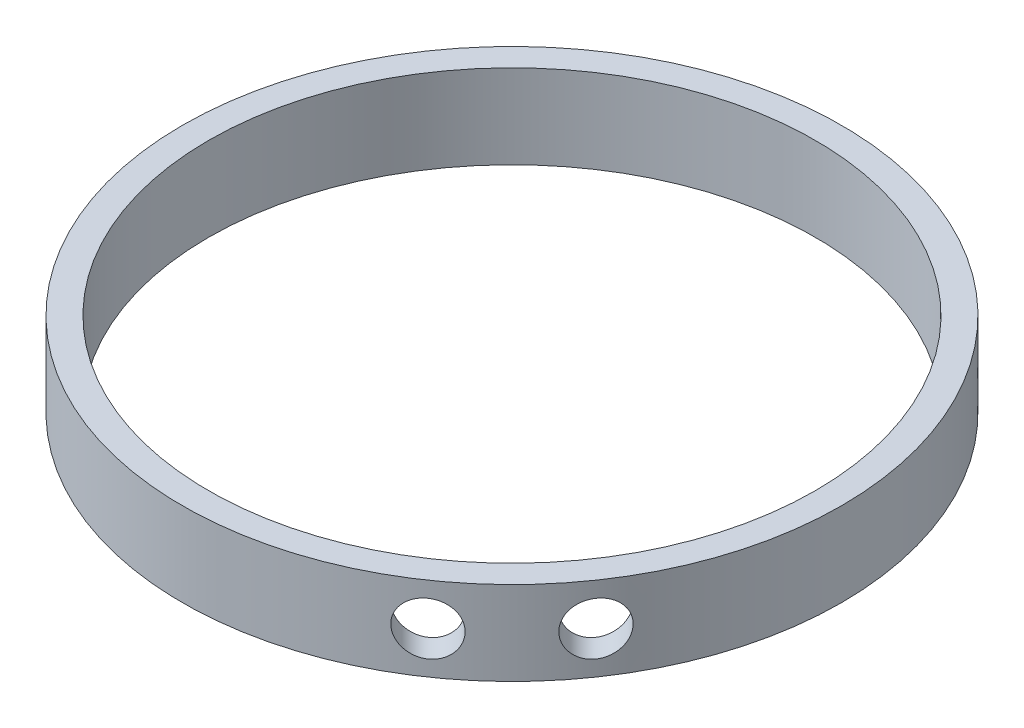
ISO-10303-21;
HEADER;
FILE_DESCRIPTION(('STEP AP214'),'2;1');
FILE_NAME('part.step','',(''),(''),'','','');
FILE_SCHEMA(('AUTOMOTIVE_DESIGN { 1 0 10303 214 1 1 1 1 }'));
ENDSEC;
DATA;
#1=APPLICATION_CONTEXT('core data for automotive mechanical design processes');
#2=APPLICATION_PROTOCOL_DEFINITION('international standard','automotive_design',2000,#1);
#3=PRODUCT_CONTEXT('',#1,'mechanical');
#4=PRODUCT('Part','Part','',(#3));
#5=PRODUCT_RELATED_PRODUCT_CATEGORY('part','',(#4));
#6=PRODUCT_DEFINITION_FORMATION('','',#4);
#7=PRODUCT_DEFINITION_CONTEXT('part definition',#1,'design');
#8=PRODUCT_DEFINITION('design','',#6,#7);
#9=PRODUCT_DEFINITION_SHAPE('','',#8);
#10=(LENGTH_UNIT() NAMED_UNIT(*) SI_UNIT(.MILLI.,.METRE.));
#11=(NAMED_UNIT(*) PLANE_ANGLE_UNIT() SI_UNIT($,.RADIAN.));
#12=(NAMED_UNIT(*) SI_UNIT($,.STERADIAN.) SOLID_ANGLE_UNIT());
#13=UNCERTAINTY_MEASURE_WITH_UNIT(LENGTH_MEASURE(1.E-05),#10,'distance_accuracy_value','');
#14=(GEOMETRIC_REPRESENTATION_CONTEXT(3) GLOBAL_UNCERTAINTY_ASSIGNED_CONTEXT((#13)) GLOBAL_UNIT_ASSIGNED_CONTEXT((#10,
#11,#12)) REPRESENTATION_CONTEXT('',''));
#15=CARTESIAN_POINT('',(0.,0.,0.));
#16=DIRECTION('',(0.,0.,1.));
#17=DIRECTION('',(1.,0.,0.));
#18=AXIS2_PLACEMENT_3D('',#15,#16,#17);
#19=CARTESIAN_POINT('',(50.6984,108.966,0.));
#20=DIRECTION('',(0.,-1.,0.));
#21=DIRECTION('',(1.,0.,0.));
#22=AXIS2_PLACEMENT_3D('',#19,#20,#21);
#23=PLANE('',#22);
#24=CARTESIAN_POINT('',(0.,108.966,0.));
#25=DIRECTION('',(0.,1.,0.));
#26=DIRECTION('',(-1.,0.,0.));
#27=AXIS2_PLACEMENT_3D('',#24,#25,#26);
#28=CIRCLE('',#27,52.832);
#29=CARTESIAN_POINT('',(-52.832,108.966,0.));
#30=VERTEX_POINT('',#29);
#31=EDGE_CURVE('E53',#30,#30,#28,.T.);
#32=ORIENTED_EDGE('',*,*,#31,.T.);
#33=EDGE_LOOP('',(#32));
#34=FACE_BOUND('',#33,.T.);
#35=CARTESIAN_POINT('',(0.,108.966,0.));
#36=DIRECTION('',(0.,-1.,0.));
#37=DIRECTION('',(1.,0.,0.));
#38=AXIS2_PLACEMENT_3D('',#35,#36,#37);
#39=CIRCLE('',#38,48.641);
#40=CARTESIAN_POINT('',(48.641,108.966,0.));
#41=VERTEX_POINT('',#40);
#42=EDGE_CURVE('E96',#41,#41,#39,.T.);
#43=ORIENTED_EDGE('',*,*,#42,.T.);
#44=EDGE_LOOP('',(#43));
#45=FACE_BOUND('',#44,.T.);
#46=ADVANCED_FACE('F41',(#34,#45),#23,.F.);
#47=CARTESIAN_POINT('',(0.,138.931800571307,0.));
#48=DIRECTION('',(0.,1.,0.));
#49=DIRECTION('',(-1.,0.,0.));
#50=AXIS2_PLACEMENT_3D('',#47,#48,#49);
#51=CYLINDRICAL_SURFACE('',#50,52.832);
#52=CARTESIAN_POINT('',(35.9911854648936,102.235,-38.6762820450936));
#53=CARTESIAN_POINT('',(35.9911891251565,102.128388948194,-38.6762790353523));
#54=CARTESIAN_POINT('',(35.9977870100752,102.021701469772,-38.6701420674387));
#55=CARTESIAN_POINT('',(36.0239957140699,101.811267276668,-38.6457276445082));
#56=CARTESIAN_POINT('',(36.043622025432,101.707524216566,-38.6274357358532));
#57=CARTESIAN_POINT('',(36.0952698779711,101.506057813562,-38.5791777823933));
#58=CARTESIAN_POINT('',(36.1272852928998,101.408331523088,-38.5492175073947));
#59=CARTESIAN_POINT('',(36.2027070266943,101.221649723681,-38.4783951198653));
#60=CARTESIAN_POINT('',(36.2461105873962,101.132692098181,-38.4375356470373));
#61=CARTESIAN_POINT('',(36.3429988416192,100.96599296856,-38.345939712509));
#62=CARTESIAN_POINT('',(36.3964886465669,100.888257186777,-38.2951982424591));
#63=CARTESIAN_POINT('',(36.511905302874,100.746256785229,-38.1851717077652));
#64=CARTESIAN_POINT('',(36.5738324920968,100.681992705181,-38.1258863009854));
#65=CARTESIAN_POINT('',(36.7042725394263,100.568748154399,-38.0003261293154));
#66=CARTESIAN_POINT('',(36.7727870537462,100.519771540518,-37.93404960628));
#67=CARTESIAN_POINT('',(36.9143499540226,100.43851712426,-37.7963058372317));
#68=CARTESIAN_POINT('',(36.9873983178574,100.406239240414,-37.724838616545));
#69=CARTESIAN_POINT('',(37.1358550292209,100.359312002503,-37.5787085060975));
#70=CARTESIAN_POINT('',(37.2112623346822,100.344654974139,-37.5040470221966));
#71=CARTESIAN_POINT('',(37.3622933241103,100.333361847808,-37.3535891440961));
#72=CARTESIAN_POINT('',(37.4379170070065,100.336725660826,-37.2777927555043));
#73=CARTESIAN_POINT('',(37.5872047581345,100.361372296027,-37.1272608371456));
#74=CARTESIAN_POINT('',(37.6608697150397,100.382646843909,-37.0525248337166));
#75=CARTESIAN_POINT('',(37.8042316035084,100.442498233258,-36.9062432670479));
#76=CARTESIAN_POINT('',(37.8739285244002,100.481075121256,-36.8346977123888));
#77=CARTESIAN_POINT('',(38.0074723074687,100.574445613952,-36.6968866836979));
#78=CARTESIAN_POINT('',(38.0713177990794,100.62924300529,-36.6306224471678));
#79=CARTESIAN_POINT('',(38.1914340384486,100.753496211505,-36.5053712780388));
#80=CARTESIAN_POINT('',(38.2477047600365,100.822952077023,-36.446384370583));
#81=CARTESIAN_POINT('',(38.3512218164106,100.974597453319,-36.3374417403975));
#82=CARTESIAN_POINT('',(38.3984630300379,101.056794142586,-36.2874911435394));
#83=CARTESIAN_POINT('',(38.4826556609733,101.231562610481,-36.1981935454399));
#84=CARTESIAN_POINT('',(38.5196070763824,101.324134391024,-36.1588465461553));
#85=CARTESIAN_POINT('',(38.5822717844099,101.517029415104,-36.0919747096342));
#86=CARTESIAN_POINT('',(38.6079849087677,101.617352774671,-36.0644500494028));
#87=CARTESIAN_POINT('',(38.6475164071539,101.822901262283,-36.0220841469506));
#88=CARTESIAN_POINT('',(38.6613348275305,101.928126371226,-36.0072428553084));
#89=CARTESIAN_POINT('',(38.6767217960953,102.140428338628,-35.9907147107065));
#90=CARTESIAN_POINT('',(38.6782971928635,102.247504128238,-35.9890205034482));
#91=CARTESIAN_POINT('',(38.6691762593249,102.460523355244,-35.9988204600144));
#92=CARTESIAN_POINT('',(38.6584799496777,102.566466794546,-36.010314601636));
#93=CARTESIAN_POINT('',(38.6250912417336,102.774185901556,-36.0461252209459));
#94=CARTESIAN_POINT('',(38.6024019687354,102.875962647639,-36.0704383580722));
#95=CARTESIAN_POINT('',(38.5456061073569,103.072492434298,-36.1311249623008));
#96=CARTESIAN_POINT('',(38.5114994854134,103.167245454226,-36.1674984648565));
#97=CARTESIAN_POINT('',(38.4327238287584,103.347084341653,-36.251196597733));
#98=CARTESIAN_POINT('',(38.3880501003922,103.432165888381,-36.2985260942427));
#99=CARTESIAN_POINT('',(38.2893030662616,103.590203258514,-36.4026733963121));
#100=CARTESIAN_POINT('',(38.2352297276956,103.663159039602,-36.4594912349831));
#101=CARTESIAN_POINT('',(38.1190729837629,103.794907505079,-36.5809178098473));
#102=CARTESIAN_POINT('',(38.0569859342879,103.85369371099,-36.64553008956));
#103=CARTESIAN_POINT('',(37.9264752799857,103.955390016683,-36.7805859584982));
#104=CARTESIAN_POINT('',(37.8580516927094,103.998300160437,-36.8510295315723));
#105=CARTESIAN_POINT('',(37.7167420562791,104.067014919109,-36.995645720619));
#106=CARTESIAN_POINT('',(37.6438571033809,104.092823717918,-37.0698174197141));
#107=CARTESIAN_POINT('',(37.4956255624286,104.126616883972,-37.2197447052237));
#108=CARTESIAN_POINT('',(37.4202789793993,104.134601287597,-37.295500288405));
#109=CARTESIAN_POINT('',(37.2692914252668,104.132518545475,-37.4463820050562));
#110=CARTESIAN_POINT('',(37.1936506444338,104.122461591004,-37.5215084698223));
#111=CARTESIAN_POINT('',(37.0442013161862,104.084602607981,-37.6690642921508));
#112=CARTESIAN_POINT('',(36.9703927723641,104.056800544638,-37.7414936444246));
#113=CARTESIAN_POINT('',(36.8267589213333,103.984242239172,-37.881659542266));
#114=CARTESIAN_POINT('',(36.7569336743323,103.93948574086,-37.9493960169037));
#115=CARTESIAN_POINT('',(36.6233364041532,103.834291732404,-38.078341416311));
#116=CARTESIAN_POINT('',(36.5595641702965,103.773854768302,-38.1395505682772));
#117=CARTESIAN_POINT('',(36.4399559147707,103.638982329924,-38.253845503396));
#118=CARTESIAN_POINT('',(36.3841235403764,103.564540458556,-38.3069275541142));
#119=CARTESIAN_POINT('',(36.2821148122894,103.403762323211,-38.4035586891762));
#120=CARTESIAN_POINT('',(36.2359408491869,103.317423123232,-38.4471054135196));
#121=CARTESIAN_POINT('',(36.154659073159,103.135259116699,-38.5235509361549));
#122=CARTESIAN_POINT('',(36.1195592939607,103.039427489813,-38.5564420048014));
#123=CARTESIAN_POINT('',(36.0615953242634,102.841120551884,-38.6106611806726));
#124=CARTESIAN_POINT('',(36.0387165771221,102.738653308543,-38.6320030447147));
#125=CARTESIAN_POINT('',(36.0119587205039,102.568784464662,-38.6569429440298));
#126=CARTESIAN_POINT('',(36.0041794195579,102.502484907529,-38.6641867821554));
#127=CARTESIAN_POINT('',(35.9937916413014,102.36913365298,-38.6738572785532));
#128=CARTESIAN_POINT('',(35.9911831617778,102.302081955887,-38.6762839388873));
#129=CARTESIAN_POINT('',(35.9911854648936,102.235,-38.6762820450936));
#130=B_SPLINE_CURVE_WITH_KNOTS('',3,(#52,#53,#54,#55,#56,#57,#58,#59,#60,#61,#62,#63,#64,#65,
#66,#67,#68,#69,#70,#71,#72,#73,#74,#75,#76,#77,#78,#79,#80,#81,#82,#83,#84,#85,#86,#87,#88,#89,
#90,#91,#92,#93,#94,#95,#96,#97,#98,#99,#100,#101,#102,#103,#104,#105,#106,#107,#108,#109,#110,
#111,#112,#113,#114,#115,#116,#117,#118,#119,#120,#121,#122,#123,#124,#125,#126,#127,#128,#129),
.UNSPECIFIED.,.T.,.F.,(4,2,2,2,2,2,2,2,2,2,2,2,2,2,2,2,2,2,2,2,2,2,2,2,2,2,2,2,2,2,2,2,2,2,2,2,
2,2,4),(0.,0.319588293392277,0.639557296123156,0.95936828016603,1.27910187863723,
1.59899794675794,1.91890682844399,2.23889635437036,2.55888431912336,2.87873287101168,
3.19857984299758,3.51827913491017,3.83797928659264,4.15775413050739,4.47753007921197,
4.79748685676229,5.11744369336031,5.43740532021613,5.7573657003217,6.07714708606956,
6.39692793345835,6.71662548881663,7.03632398398792,7.35616474908745,7.67600663035106,
7.99599447046622,8.31598142431616,8.63589006353334,8.95579804976985,9.27552538196366,
9.59525334103685,9.91498613153832,10.2347077894689,10.554575844427,10.8745229777065,
11.1947016846305,11.5144981669767,11.7155900482812,11.9166818435123),.UNSPECIFIED.);
#131=CARTESIAN_POINT('',(35.9911854648936,102.235,-38.6762820450936));
#132=VERTEX_POINT('',#131);
#133=EDGE_CURVE('E10',#132,#132,#130,.T.);
#134=ORIENTED_EDGE('',*,*,#133,.T.);
#135=EDGE_LOOP('',(#134));
#136=FACE_BOUND('',#135,.T.);
#137=CARTESIAN_POINT('',(45.7887465015735,102.235,26.3554722555798));
#138=CARTESIAN_POINT('',(45.7887469768974,102.119294353157,26.3554711506068));
#139=CARTESIAN_POINT('',(45.7862851066702,102.003604677743,26.3597498776435));
#140=CARTESIAN_POINT('',(45.7764529513878,101.77302536689,26.3768208803745));
#141=CARTESIAN_POINT('',(45.7690813264415,101.658135958498,26.3896154800829));
#142=CARTESIAN_POINT('',(45.749465389697,101.429933427851,26.4236073240889));
#143=CARTESIAN_POINT('',(45.7372170611276,101.31662168489,26.4448114950016));
#144=CARTESIAN_POINT('',(45.7079187187507,101.0924348145,26.4954193148572));
#145=CARTESIAN_POINT('',(45.690866913648,100.981560612729,26.5248260226203));
#146=CARTESIAN_POINT('',(45.6520967395134,100.763247326726,26.5914980883896));
#147=CARTESIAN_POINT('',(45.630386472878,100.655802645652,26.6287497996316));
#148=CARTESIAN_POINT('',(45.5824127825326,100.444865310929,26.7107866437121));
#149=CARTESIAN_POINT('',(45.5561476817662,100.341374130116,26.7555745511412));
#150=CARTESIAN_POINT('',(45.4707567592938,100.037994553879,26.9006155141694));
#151=CARTESIAN_POINT('',(45.4049885345326,99.8449368518761,27.0116269453659));
#152=CARTESIAN_POINT('',(45.2559818971568,99.4792339202398,27.2605513800785));
#153=CARTESIAN_POINT('',(45.1724567500596,99.3070070903629,27.3989029053204));
#154=CARTESIAN_POINT('',(44.9904377536082,98.991080089496,27.6967716139618));
#155=CARTESIAN_POINT('',(44.8919412510913,98.8473849852125,27.8562925482804));
#156=CARTESIAN_POINT('',(44.6789353889756,98.588199780565,28.1967090218338));
#157=CARTESIAN_POINT('',(44.5640344370214,98.4736846219928,28.3781020592051));
#158=CARTESIAN_POINT('',(44.3232249518875,98.2815891627024,28.7527653797535));
#159=CARTESIAN_POINT('',(44.1973152761317,98.2040127011853,28.9460368951571));
#160=CARTESIAN_POINT('',(43.9355356760905,98.0870481639952,29.3418820111879));
#161=CARTESIAN_POINT('',(43.7995429565049,98.0482617185712,29.5445526228933));
#162=CARTESIAN_POINT('',(43.5229792739286,98.0122809948412,29.9504724406895));
#163=CARTESIAN_POINT('',(43.3824083946243,98.015085956692,30.1537216361421));
#164=CARTESIAN_POINT('',(43.1014628339092,98.0624166959423,30.5539460400328));
#165=CARTESIAN_POINT('',(42.961090626198,98.1067358676786,30.7509473265223));
#166=CARTESIAN_POINT('',(42.6842290739996,98.2358837372617,31.1341082964233));
#167=CARTESIAN_POINT('',(42.5477394163231,98.3207091577615,31.3202688555876));
#168=CARTESIAN_POINT('',(42.2852231881424,98.5271059374471,31.6737734105617));
#169=CARTESIAN_POINT('',(42.1590689644525,98.6480982328062,31.8413607178014));
#170=CARTESIAN_POINT('',(41.919286769872,98.9239850936208,32.1563813755126));
#171=CARTESIAN_POINT('',(41.8056578823957,99.0788771758601,32.3038162009028));
#172=CARTESIAN_POINT('',(41.5963865738241,99.4159361339375,32.5728350654279));
#173=CARTESIAN_POINT('',(41.5005271781607,99.597717349688,32.6947336963483));
#174=CARTESIAN_POINT('',(41.3284198886111,99.9848759584561,32.9120222352762));
#175=CARTESIAN_POINT('',(41.2521712470923,100.190252451505,33.0074131538645));
#176=CARTESIAN_POINT('',(41.1225175678328,100.617280682712,33.1688026521253));
#177=CARTESIAN_POINT('',(41.0689637256353,100.838814876238,33.2349928156349));
#178=CARTESIAN_POINT('',(40.9859299156716,101.293051132158,33.3373387162699));
#179=CARTESIAN_POINT('',(40.9564496141447,101.525753039672,33.3734948697934));
#180=CARTESIAN_POINT('',(40.9226877477209,101.995178680484,33.4148855628808));
#181=CARTESIAN_POINT('',(40.9183518374982,102.231892630195,33.4201867902116));
#182=CARTESIAN_POINT('',(40.9348925084418,102.703107743698,33.3999245994594));
#183=CARTESIAN_POINT('',(40.9557689615406,102.937608918722,33.374361338154));
#184=CARTESIAN_POINT('',(41.0219538357132,103.397655992415,33.2929759492939));
#185=CARTESIAN_POINT('',(41.0672535445863,103.623205053675,33.2371646117176));
#186=CARTESIAN_POINT('',(41.180620786122,104.059042960559,33.09659801454));
#187=CARTESIAN_POINT('',(41.2486882045293,104.269331882757,33.0118429001872));
#188=CARTESIAN_POINT('',(41.4051753787734,104.668844340732,32.8153530804978));
#189=CARTESIAN_POINT('',(41.4936081434409,104.85805429672,32.7036011280679));
#190=CARTESIAN_POINT('',(41.6876466103197,105.209959721522,32.4558936032796));
#191=CARTESIAN_POINT('',(41.793252342508,105.372655144052,32.3199379886716));
#192=CARTESIAN_POINT('',(42.0182988648291,105.667507884818,32.0268162427235));
#193=CARTESIAN_POINT('',(42.137779560571,105.799573673035,31.8695887061782));
#194=CARTESIAN_POINT('',(42.3862984866412,106.029041672343,31.5383061200087));
#195=CARTESIAN_POINT('',(42.5153369946552,106.126442875838,31.3642505814313));
#196=CARTESIAN_POINT('',(42.7799041163965,106.284792351173,31.0024291627716));
#197=CARTESIAN_POINT('',(42.9154767414472,106.345439761223,30.8145638771563));
#198=CARTESIAN_POINT('',(43.1879978047673,106.427695695312,30.4314365397767));
#199=CARTESIAN_POINT('',(43.3249463491987,106.449301183367,30.2361739139844));
#200=CARTESIAN_POINT('',(43.5982629846486,106.453234830852,29.8407483297478));
#201=CARTESIAN_POINT('',(43.7345953191447,106.435001790714,29.6405551449591));
#202=CARTESIAN_POINT('',(44.0010279639457,106.358860876206,29.243579417199));
#203=CARTESIAN_POINT('',(44.1311276501855,106.300949037708,29.0467972170176));
#204=CARTESIAN_POINT('',(44.38363692113,106.146055503281,28.6595053946507));
#205=CARTESIAN_POINT('',(44.505909637687,106.048525981876,28.4691260186579));
#206=CARTESIAN_POINT('',(44.7378133158577,105.816919089062,28.1032949071589));
#207=CARTESIAN_POINT('',(44.8474440745582,105.682841131139,27.9278434112685));
#208=CARTESIAN_POINT('',(45.0004484018116,105.457066064935,27.6801264283481));
#209=CARTESIAN_POINT('',(45.0496013338218,105.377574255038,27.6000333996515));
#210=CARTESIAN_POINT('',(45.1437974703461,105.210877960648,27.4456903958673));
#211=CARTESIAN_POINT('',(45.1888422778439,105.123676510829,27.3714381432867));
#212=CARTESIAN_POINT('',(45.2745817457268,104.94208632823,27.2293842859287));
#213=CARTESIAN_POINT('',(45.3152738914651,104.847693494137,27.1615864124762));
#214=CARTESIAN_POINT('',(45.3920230621743,104.652446841802,27.0331289698074));
#215=CARTESIAN_POINT('',(45.4280820019958,104.551595718685,26.9724664525127));
#216=CARTESIAN_POINT('',(45.4947322172362,104.346048992562,26.8598913991031));
#217=CARTESIAN_POINT('',(45.5254129726214,104.241460259918,26.8078366967363));
#218=CARTESIAN_POINT('',(45.581915943942,104.027491003117,26.7116505363275));
#219=CARTESIAN_POINT('',(45.6077401542748,103.918112468797,26.6675158261898));
#220=CARTESIAN_POINT('',(45.654358829557,103.695429206873,26.5876265082524));
#221=CARTESIAN_POINT('',(45.6751585621778,103.582128734816,26.5518631251693));
#222=CARTESIAN_POINT('',(45.7116236136711,103.352377498124,26.4890356186028));
#223=CARTESIAN_POINT('',(45.7272904571494,103.235927680075,26.4619689120194));
#224=CARTESIAN_POINT('',(45.7564210400799,102.973448610384,26.4115733304544));
#225=CARTESIAN_POINT('',(45.7685337059033,102.826816218828,26.3905627956786));
#226=CARTESIAN_POINT('',(45.7846960420405,102.531780437004,26.3625131224042));
#227=CARTESIAN_POINT('',(45.7887458920339,102.383377086276,26.3554736725605));
#228=CARTESIAN_POINT('',(45.7887465015735,102.235,26.3554722555798));
#229=B_SPLINE_CURVE_WITH_KNOTS('',3,(#137,#138,#139,#140,#141,#142,#143,#144,#145,#146,#147,
#148,#149,#150,#151,#152,#153,#154,#155,#156,#157,#158,#159,#160,#161,#162,#163,#164,#165,#166,
#167,#168,#169,#170,#171,#172,#173,#174,#175,#176,#177,#178,#179,#180,#181,#182,#183,#184,#185,
#186,#187,#188,#189,#190,#191,#192,#193,#194,#195,#196,#197,#198,#199,#200,#201,#202,#203,#204,
#205,#206,#207,#208,#209,#210,#211,#212,#213,#214,#215,#216,#217,#218,#219,#220,#221,#222,#223,
#224,#225,#226,#227,#228),.UNSPECIFIED.,.T.,.F.,(4,2,2,2,2,2,2,2,2,2,2,2,2,2,2,2,2,2,2,2,2,2,2,
2,2,2,2,2,2,2,2,2,2,2,2,2,2,2,2,2,2,2,2,2,2,4),(0.,0.346984332137615,0.694063396468765,
1.04142893111864,1.38892417594664,1.73581985661889,2.08284353395555,2.77606287187729,
3.48146601807491,4.18699431900244,4.91367823951538,5.64043767100476,6.378301973798,
7.11615279639117,7.85035092342221,8.58448965678939,9.30745216721666,10.0303617371412,
10.7437601523616,11.4571313662301,12.1657499555024,12.8743587201692,13.5814353750255,
14.2885084382666,14.995329442953,15.7021469006536,16.4094171126918,17.1166885593493,
17.8260470575306,18.5354261729827,19.2505363838565,19.9657022008668,20.6910073261841,
21.4163849240025,22.1521542074707,22.8879352989592,23.2568209177431,23.6255619765381,
23.9945149290288,24.3633149036573,24.7252322732976,25.087000691194,25.44838816814,
25.8096682057877,26.2546393282842,26.6996005345037),.UNSPECIFIED.);
#230=CARTESIAN_POINT('',(45.7887465015735,102.235,26.3554722555798));
#231=VERTEX_POINT('',#230);
#232=EDGE_CURVE('E63',#231,#231,#229,.T.);
#233=ORIENTED_EDGE('',*,*,#232,.T.);
#234=EDGE_LOOP('',(#233));
#235=FACE_BOUND('',#234,.T.);
#236=CARTESIAN_POINT('',(33.4150502722189,102.235,40.9225443894326));
#237=CARTESIAN_POINT('',(33.4150432446465,101.999249872019,40.9225519275344));
#238=CARTESIAN_POINT('',(33.3996135144003,101.763338146185,40.9351642200645));
#239=CARTESIAN_POINT('',(33.338198076955,101.298028105622,40.9851958857016));
#240=CARTESIAN_POINT('',(33.2921776055408,101.068637511327,41.0226434822657));
#241=CARTESIAN_POINT('',(33.1706582061017,100.623168814806,41.1209646190815));
#242=CARTESIAN_POINT('',(33.0951736216175,100.407084294167,41.1818267605996));
#243=CARTESIAN_POINT('',(32.9165388032736,99.9943005426802,41.3247470306754));
#244=CARTESIAN_POINT('',(32.8133952074522,99.7975966760306,41.4068000733381));
#245=CARTESIAN_POINT('',(32.581830433631,99.4288455996199,41.589256213939));
#246=CARTESIAN_POINT('',(32.453384312118,99.2568230125152,41.6896774123726));
#247=CARTESIAN_POINT('',(32.1744909928582,98.9424224994399,41.9052903166819));
#248=CARTESIAN_POINT('',(32.0240428243128,98.8000458822138,42.0204826742795));
#249=CARTESIAN_POINT('',(31.7043102887013,98.5482202405646,42.2622433477628));
#250=CARTESIAN_POINT('',(31.5349471913656,98.4389164430616,42.388858756057));
#251=CARTESIAN_POINT('',(31.1823708282104,98.256872248922,42.6488911932475));
#252=CARTESIAN_POINT('',(30.9991569624093,98.1841334372367,42.7823085167047));
#253=CARTESIAN_POINT('',(30.6218120387886,98.0763598555263,43.0532149002316));
#254=CARTESIAN_POINT('',(30.4275881391548,98.0417202319882,43.1907317137458));
#255=CARTESIAN_POINT('',(30.0352535421622,98.0121009666629,43.4644797384357));
#256=CARTESIAN_POINT('',(29.8371425098051,98.0171247582291,43.6007108372952));
#257=CARTESIAN_POINT('',(29.4394262629207,98.0667950891109,43.8702517951056));
#258=CARTESIAN_POINT('',(29.2398446751664,98.11204764669,44.0034848950975));
#259=CARTESIAN_POINT('',(28.8479461009743,98.2415971470128,44.2613974690661));
#260=CARTESIAN_POINT('',(28.655629808078,98.3258978071344,44.3860761273625));
#261=CARTESIAN_POINT('',(28.2817307586343,98.5324520588184,44.6252595276468));
#262=CARTESIAN_POINT('',(28.1002985957217,98.6551350500591,44.7396292978547));
#263=CARTESIAN_POINT('',(27.7563206751103,98.9348850275003,44.9538430379232));
#264=CARTESIAN_POINT('',(27.5937750842191,99.0919523173502,45.0536868794915));
#265=CARTESIAN_POINT('',(27.2937979077102,99.4354410148417,45.2360424764529));
#266=CARTESIAN_POINT('',(27.1562408526952,99.6217064969634,45.3186411523858));
#267=CARTESIAN_POINT('',(26.9101845611396,100.019124292741,45.4651819605987));
#268=CARTESIAN_POINT('',(26.8016808674123,100.230272781834,45.5291269547458));
#269=CARTESIAN_POINT('',(26.6203290462736,100.665746340536,45.635393321464));
#270=CARTESIAN_POINT('',(26.5466393765446,100.88959581596,45.6782262717745));
#271=CARTESIAN_POINT('',(26.4338457775264,101.348676967579,45.7435932736138));
#272=CARTESIAN_POINT('',(26.3947347471159,101.58390629632,45.7661314929168));
#273=CARTESIAN_POINT('',(26.3533565581896,102.051558915164,45.7899702170729));
#274=CARTESIAN_POINT('',(26.3500291320695,102.283857888073,45.7918818918643));
#275=CARTESIAN_POINT('',(26.3775970097072,102.745720983245,45.7760073358555));
#276=CARTESIAN_POINT('',(26.4084896836097,102.975285314298,45.7582226187465));
#277=CARTESIAN_POINT('',(26.5027884409109,103.422893459685,45.7036685949148));
#278=CARTESIAN_POINT('',(26.5658744925304,103.641027795092,45.6670861307305));
#279=CARTESIAN_POINT('',(26.7220038909998,104.062276388555,45.5759021667251));
#280=CARTESIAN_POINT('',(26.8150495034517,104.265389509247,45.5212993041575));
#281=CARTESIAN_POINT('',(27.0297260337878,104.654837699242,45.3941616810539));
#282=CARTESIAN_POINT('',(27.1518370048666,104.840809085083,45.3213245805722));
#283=CARTESIAN_POINT('',(27.4196004740426,105.187167736381,45.1598287470435));
#284=CARTESIAN_POINT('',(27.5652566540093,105.3475509927,45.071167539284));
#285=CARTESIAN_POINT('',(27.8803535024453,105.643350616093,44.876957718349));
#286=CARTESIAN_POINT('',(28.050385934898,105.77785201205,44.770975103257));
#287=CARTESIAN_POINT('',(28.4054450114346,106.012219213811,44.5465486429774));
#288=CARTESIAN_POINT('',(28.590473579847,106.112080565839,44.4281031979559));
#289=CARTESIAN_POINT('',(28.9741919202578,106.27631290778,44.1788389815857));
#290=CARTESIAN_POINT('',(29.1730885295979,106.339884025415,44.0478106502201));
#291=CARTESIAN_POINT('',(29.5750748159311,106.426321659144,43.7789176249928));
#292=CARTESIAN_POINT('',(29.7781645830072,106.449187299828,43.641052784171));
#293=CARTESIAN_POINT('',(30.1828388180644,106.453307631185,43.3621596114406));
#294=CARTESIAN_POINT('',(30.3844220203991,106.434530585301,43.2211289478862));
#295=CARTESIAN_POINT('',(30.7801284992184,106.355482220755,42.940223500495));
#296=CARTESIAN_POINT('',(30.9742522921927,106.295213780444,42.8003486371589));
#297=CARTESIAN_POINT('',(31.3469499998364,106.135686461532,42.5281263829309));
#298=CARTESIAN_POINT('',(31.5256989473785,106.036966864719,42.3957026857377));
#299=CARTESIAN_POINT('',(31.8656011585399,105.803104412623,42.1408217691322));
#300=CARTESIAN_POINT('',(32.02675649291,105.667965850326,42.0183633772462));
#301=CARTESIAN_POINT('',(32.3248775764817,105.367285486626,41.7894411165149));
#302=CARTESIAN_POINT('',(32.4621660418137,105.202223271158,41.6827673458141));
#303=CARTESIAN_POINT('',(32.7119168816158,104.844995507904,41.4870577780169));
#304=CARTESIAN_POINT('',(32.8243745970409,104.652824884778,41.3980252913121));
#305=CARTESIAN_POINT('',(33.020784951241,104.24861571896,41.2415285568495));
#306=CARTESIAN_POINT('',(33.1049632126197,104.036752533644,41.1738938564572));
#307=CARTESIAN_POINT('',(33.2439772642713,103.59802182904,41.0617370671731));
#308=CARTESIAN_POINT('',(33.2988471135659,103.371172071653,41.0171881523181));
#309=CARTESIAN_POINT('',(33.3639162082907,102.991639427934,40.9642566686684));
#310=CARTESIAN_POINT('',(33.3830704102588,102.841401282249,40.9486399066523));
#311=CARTESIAN_POINT('',(33.4086397014157,102.539131177733,40.9277813417044));
#312=CARTESIAN_POINT('',(33.415054806207,102.387099221099,40.9225395260655));
#313=CARTESIAN_POINT('',(33.4150502722189,102.235,40.9225443894326));
#314=B_SPLINE_CURVE_WITH_KNOTS('',3,(#236,#237,#238,#239,#240,#241,#242,#243,#244,#245,#246,
#247,#248,#249,#250,#251,#252,#253,#254,#255,#256,#257,#258,#259,#260,#261,#262,#263,#264,#265,
#266,#267,#268,#269,#270,#271,#272,#273,#274,#275,#276,#277,#278,#279,#280,#281,#282,#283,#284,
#285,#286,#287,#288,#289,#290,#291,#292,#293,#294,#295,#296,#297,#298,#299,#300,#301,#302,#303,
#304,#305,#306,#307,#308,#309,#310,#311,#312,#313),.UNSPECIFIED.,.T.,.F.,(4,2,2,2,2,2,2,2,2,2,2,
2,2,2,2,2,2,2,2,2,2,2,2,2,2,2,2,2,2,2,2,2,2,2,2,2,2,2,4),(0.,0.706695774852987,1.41419603567282,
2.1213523042066,2.82833901007428,3.53602619101719,4.24374460674281,4.95452705036979,
5.66534030102313,6.38345820981671,7.10163828117412,7.83082408946343,8.56007933048288,
9.29780384256227,10.0355348697875,10.7694526255155,11.5032577235358,12.2182806094715,
12.9331566230977,13.6267903805954,14.3203708352126,15.0071870100596,15.694055135526,
16.3931689569337,17.0923922078375,17.8130279283181,18.5337562688015,19.2698111223833,
20.0058818053489,20.7425136523227,21.4790944026506,22.2056963711167,22.9322127268427,
23.6479762763223,24.3638740120846,25.0739163515986,25.783131752657,26.2390721565013,
26.6950120019194),.UNSPECIFIED.);
#315=CARTESIAN_POINT('',(33.4150502722189,102.235,40.9225443894326));
#316=VERTEX_POINT('',#315);
#317=EDGE_CURVE('E104',#316,#316,#314,.T.);
#318=ORIENTED_EDGE('',*,*,#317,.T.);
#319=EDGE_LOOP('',(#318));
#320=FACE_BOUND('',#319,.T.);
#321=ORIENTED_EDGE('',*,*,#31,.F.);
#322=EDGE_LOOP('',(#321));
#323=FACE_BOUND('',#322,.T.);
#324=CARTESIAN_POINT('',(0.,95.504,0.));
#325=DIRECTION('',(0.,1.,0.));
#326=DIRECTION('',(-1.,0.,0.));
#327=AXIS2_PLACEMENT_3D('',#324,#325,#326);
#328=CIRCLE('',#327,52.832);
#329=CARTESIAN_POINT('',(-52.832,95.504,0.));
#330=VERTEX_POINT('',#329);
#331=EDGE_CURVE('E57',#330,#330,#328,.T.);
#332=ORIENTED_EDGE('',*,*,#331,.T.);
#333=EDGE_LOOP('',(#332));
#334=FACE_BOUND('',#333,.T.);
#335=ADVANCED_FACE('F69',(#136,#235,#320,#323,#334),#51,.T.);
#336=CARTESIAN_POINT('',(52.832,95.504,0.));
#337=DIRECTION('',(0.,1.,0.));
#338=DIRECTION('',(-1.,0.,0.));
#339=AXIS2_PLACEMENT_3D('',#336,#337,#338);
#340=PLANE('',#339);
#341=CARTESIAN_POINT('',(0.,95.504,0.));
#342=DIRECTION('',(0.,-1.,0.));
#343=DIRECTION('',(1.,0.,0.));
#344=AXIS2_PLACEMENT_3D('',#341,#342,#343);
#345=CIRCLE('',#344,48.641);
#346=CARTESIAN_POINT('',(48.641,95.504,0.));
#347=VERTEX_POINT('',#346);
#348=EDGE_CURVE('E138',#347,#347,#345,.T.);
#349=ORIENTED_EDGE('',*,*,#348,.F.);
#350=EDGE_LOOP('',(#349));
#351=FACE_BOUND('',#350,.T.);
#352=ORIENTED_EDGE('',*,*,#331,.F.);
#353=EDGE_LOOP('',(#352));
#354=FACE_BOUND('',#353,.T.);
#355=ADVANCED_FACE('F116',(#351,#354),#340,.F.);
#356=CARTESIAN_POINT('',(30.6226733728459,102.235,44.0930575544495));
#357=DIRECTION('',(0.707106781186549,0.,0.707106781186546));
#358=DIRECTION('',(0.707106781186546,0.,-0.707106781186549));
#359=AXIS2_PLACEMENT_3D('',#356,#357,#358);
#360=CYLINDRICAL_SURFACE('',#359,4.21639999999999);
#361=CARTESIAN_POINT('',(30.4351813176965,102.235,37.9426754349102));
#362=CARTESIAN_POINT('',(30.4351743355523,101.99944599562,37.9426829659169));
#363=CARTESIAN_POINT('',(30.4196475912068,101.763732061611,37.9551517907548));
#364=CARTESIAN_POINT('',(30.3578414656586,101.298814922458,38.0046029995685));
#365=CARTESIAN_POINT('',(30.3115274312146,101.069619357672,38.0416130062385));
#366=CARTESIAN_POINT('',(30.189217358597,100.624530843604,38.1387480057138));
#367=CARTESIAN_POINT('',(30.113235821002,100.408631455145,38.1988617059075));
#368=CARTESIAN_POINT('',(29.9333957368575,99.9961983398058,38.3399491196911));
#369=CARTESIAN_POINT('',(29.829543840659,99.7996600083162,38.4209178567222));
#370=CARTESIAN_POINT('',(29.59632770775,99.4311764244364,38.6008538353581));
#371=CARTESIAN_POINT('',(29.4669343170875,99.2592596665476,38.699841634406));
#372=CARTESIAN_POINT('',(29.1859269291588,98.9450191190377,38.9122024804536));
#373=CARTESIAN_POINT('',(29.0343119295669,98.8026966649954,39.0255761763112));
#374=CARTESIAN_POINT('',(28.7119069709873,98.5507901438982,39.2633868202832));
#375=CARTESIAN_POINT('',(28.5410231254514,98.4413768176636,39.3878772633553));
#376=CARTESIAN_POINT('',(28.185189922933,98.2590223862079,39.6432829027353));
#377=CARTESIAN_POINT('',(28.0002398481951,98.1860831435846,39.7741984267736));
#378=CARTESIAN_POINT('',(27.6188617148592,98.077656269509,40.0399799643385));
#379=CARTESIAN_POINT('',(27.4223218260574,98.042632622398,40.1748746142533));
#380=CARTESIAN_POINT('',(27.0251606466091,98.012175190682,40.443108344836));
#381=CARTESIAN_POINT('',(26.824538945086,98.0167454114768,40.5764472667568));
#382=CARTESIAN_POINT('',(26.4210380740973,98.0654587569703,40.8403573282106));
#383=CARTESIAN_POINT('',(26.2181838113095,98.1103169780426,40.9708346252552));
#384=CARTESIAN_POINT('',(25.819646198712,98.2391689683398,41.2231540348787));
#385=CARTESIAN_POINT('',(25.6239636611877,98.3231671559592,41.3449951707574));
#386=CARTESIAN_POINT('',(25.2428498130798,98.5294620627004,41.5787940659477));
#387=CARTESIAN_POINT('',(25.0575986851967,98.6522746335274,41.6905910045019));
#388=CARTESIAN_POINT('',(24.7061871816687,98.9326142336994,41.8997980376037));
#389=CARTESIAN_POINT('',(24.5400270778254,99.0901417571932,41.9972079273264));
#390=CARTESIAN_POINT('',(24.2333587590774,99.4348101432963,42.1749035959427));
#391=CARTESIAN_POINT('',(24.0927057254942,99.6217717909002,42.255286514979));
#392=CARTESIAN_POINT('',(23.841081433807,100.020951710156,42.3977676094894));
#393=CARTESIAN_POINT('',(23.7301046760155,100.233165291503,42.4598691731291));
#394=CARTESIAN_POINT('',(23.5451920440963,100.670026287458,42.5626799003574));
#395=CARTESIAN_POINT('',(23.4702360032885,100.894102363885,42.6039800728535));
#396=CARTESIAN_POINT('',(23.3556235517619,101.353741739582,42.6669200109347));
#397=CARTESIAN_POINT('',(23.3159583854881,101.589302174313,42.6885646530227));
#398=CARTESIAN_POINT('',(23.2744112163206,102.056273269103,42.7112303440062));
#399=CARTESIAN_POINT('',(23.2712435796962,102.287536417404,42.7129531520556));
#400=CARTESIAN_POINT('',(23.299492391889,102.747288834444,42.6975501554941));
#401=CARTESIAN_POINT('',(23.3309057667225,102.975778347911,42.6804260262297));
#402=CARTESIAN_POINT('',(23.4264444567734,103.420827664998,42.6280596334829));
#403=CARTESIAN_POINT('',(23.4901883552937,103.637494656893,42.593028588396));
#404=CARTESIAN_POINT('',(23.6477079829887,104.055918599955,42.5057742989941));
#405=CARTESIAN_POINT('',(23.7414863685782,104.257674230337,42.4535495339607));
#406=CARTESIAN_POINT('',(23.9579884444556,104.64527261049,42.3317536201311));
#407=CARTESIAN_POINT('',(24.0812830652483,104.830687880892,42.2618385406041));
#408=CARTESIAN_POINT('',(24.3514869221182,105.176178321986,42.1067238233278));
#409=CARTESIAN_POINT('',(24.4984004502691,105.336248876475,42.0215214072067));
#410=CARTESIAN_POINT('',(24.8169635049869,105.6326192609,41.8342025499022));
#411=CARTESIAN_POINT('',(24.9893172589622,105.767845548839,41.7315844783996));
#412=CARTESIAN_POINT('',(25.3491810133062,106.003783909793,41.5139746565548));
#413=CARTESIAN_POINT('',(25.5366933181471,106.10449072276,41.3989810239396));
#414=CARTESIAN_POINT('',(25.9263258328778,106.270914765559,41.1561230792664));
#415=CARTESIAN_POINT('',(26.1286956882958,106.335681590167,41.028006620894));
#416=CARTESIAN_POINT('',(26.5377183993814,106.42431227237,40.7646357813789));
#417=CARTESIAN_POINT('',(26.7443713678428,106.448175051389,40.6293812121122));
#418=CARTESIAN_POINT('',(27.1562160914411,106.454016163908,40.355272862499));
#419=CARTESIAN_POINT('',(27.3614060838009,106.435950477645,40.2164154509299));
#420=CARTESIAN_POINT('',(27.764176829622,106.357935430813,39.9394179765665));
#421=CARTESIAN_POINT('',(27.9617582150218,106.297989556584,39.8012778550251));
#422=CARTESIAN_POINT('',(28.3405663746943,106.138844829808,39.5324210500812));
#423=CARTESIAN_POINT('',(28.522004401863,106.040290027722,39.4016209076799));
#424=CARTESIAN_POINT('',(28.8669718739414,105.806457007895,39.1495912156427));
#425=CARTESIAN_POINT('',(29.0305036999982,105.671183681287,39.0283603940889));
#426=CARTESIAN_POINT('',(29.3325277641386,105.370344382254,38.8018656786643));
#427=CARTESIAN_POINT('',(29.4714088037014,105.205351210935,38.6963590715411));
#428=CARTESIAN_POINT('',(29.7240399428432,104.848127598529,38.5026459203198));
#429=CARTESIAN_POINT('',(29.837785609283,104.655892362542,38.4144424282886));
#430=CARTESIAN_POINT('',(30.036273168521,104.251760718805,38.2594423690394));
#431=CARTESIAN_POINT('',(30.1212880990495,104.0400752121,38.1924446872229));
#432=CARTESIAN_POINT('',(30.2617400768597,103.601644828997,38.0812561022473));
#433=CARTESIAN_POINT('',(30.3172112872151,103.374917688914,38.0370388587222));
#434=CARTESIAN_POINT('',(30.3831908779006,102.994876692435,37.9843338623308));
#435=CARTESIAN_POINT('',(30.4026659771568,102.844007145411,37.9687379814239));
#436=CARTESIAN_POINT('',(30.4286634514225,102.540447483556,37.9479063334547));
#437=CARTESIAN_POINT('',(30.4351858456347,102.387757371424,37.9426705510332));
#438=CARTESIAN_POINT('',(30.4351813176965,102.235,37.9426754349102));
#439=B_SPLINE_CURVE_WITH_KNOTS('',3,(#361,#362,#363,#364,#365,#366,#367,#368,#369,#370,#371,
#372,#373,#374,#375,#376,#377,#378,#379,#380,#381,#382,#383,#384,#385,#386,#387,#388,#389,#390,
#391,#392,#393,#394,#395,#396,#397,#398,#399,#400,#401,#402,#403,#404,#405,#406,#407,#408,#409,
#410,#411,#412,#413,#414,#415,#416,#417,#418,#419,#420,#421,#422,#423,#424,#425,#426,#427,#428,
#429,#430,#431,#432,#433,#434,#435,#436,#437,#438),.UNSPECIFIED.,.T.,.F.,(4,2,2,2,2,2,2,2,2,2,2,
2,2,2,2,2,2,2,2,2,2,2,2,2,2,2,2,2,2,2,2,2,2,2,2,2,2,2,4),(0.,0.706105081344688,1.41300628196075,
2.11956240228249,2.82595007573452,3.53314875635276,4.2403793456309,4.95121832588152,
5.66209360237001,6.38157302215424,7.10112522685419,7.83370724362506,8.56637197944506,
9.30921528327166,10.0520691617581,10.7905635080881,11.5289208996574,12.2449130141747,
12.9607274437276,13.6512467270348,14.3417046334915,15.024200075516,15.7067558978597,
16.4037665367012,17.1009039811405,17.8233424193777,18.5458908932953,19.2867325931704,
20.0275938275997,20.7692332275851,21.5108108967357,22.2405114955858,22.9701149414974,
23.6869242447507,24.4038598713177,25.1137768952306,25.822871209739,26.2807828311973,
26.7386937737844),.UNSPECIFIED.);
#440=CARTESIAN_POINT('',(30.4351813176965,102.235,37.9426754349102));
#441=VERTEX_POINT('',#440);
#442=EDGE_CURVE('E95',#441,#441,#439,.T.);
#443=ORIENTED_EDGE('',*,*,#442,.T.);
#444=EDGE_LOOP('',(#443));
#445=FACE_BOUND('',#444,.T.);
#446=ORIENTED_EDGE('',*,*,#317,.F.);
#447=EDGE_LOOP('',(#446));
#448=FACE_BOUND('',#447,.T.);
#449=ADVANCED_FACE('F83',(#445,#448),#360,.F.);
#450=CARTESIAN_POINT('',(44.0930575544496,102.235,30.6226733728458));
#451=DIRECTION('',(0.707106781186549,0.,0.707106781186546));
#452=DIRECTION('',(0.707106781186546,0.,-0.707106781186549));
#453=AXIS2_PLACEMENT_3D('',#450,#451,#452);
#454=CYLINDRICAL_SURFACE('',#453,4.21639999999999);
#455=CARTESIAN_POINT('',(42.7099758979678,102.235,23.276701651974));
#456=CARTESIAN_POINT('',(42.7099763668921,102.119796370169,23.2767004688639));
#457=CARTESIAN_POINT('',(42.7076197810419,102.00460904717,23.2810263224511));
#458=CARTESIAN_POINT('',(42.6982080684265,101.775034520297,23.2982833906724));
#459=CARTESIAN_POINT('',(42.6911516646765,101.660647542423,23.3112169440988));
#460=CARTESIAN_POINT('',(42.6723742912664,101.433450040725,23.3455720620693));
#461=CARTESIAN_POINT('',(42.6606495143379,101.320640881607,23.3670005545562));
#462=CARTESIAN_POINT('',(42.6326026306998,101.097454421432,23.4181323673945));
#463=CARTESIAN_POINT('',(42.6162788018739,100.987078048059,23.4478387873726));
#464=CARTESIAN_POINT('',(42.5791648576945,100.769766098336,23.5151669049749));
#465=CARTESIAN_POINT('',(42.5583832245487,100.662824424765,23.5527735674299));
#466=CARTESIAN_POINT('',(42.5124581342522,100.4528708313,23.6355668834118));
#467=CARTESIAN_POINT('',(42.4873130695422,100.349860376855,23.6807563303564));
#468=CARTESIAN_POINT('',(42.4055538610684,100.047867838235,23.8270515336438));
#469=CARTESIAN_POINT('',(42.3425717399775,99.8556672794775,23.9389646562435));
#470=CARTESIAN_POINT('',(42.1995897119833,99.490858051758,24.1901374215124));
#471=CARTESIAN_POINT('',(42.1192645745273,99.3187371945748,24.3299151040461));
#472=CARTESIAN_POINT('',(41.9440525451819,99.0027749642543,24.6307450103914));
#473=CARTESIAN_POINT('',(41.8491627483494,98.8589392457143,24.7918014773941));
#474=CARTESIAN_POINT('',(41.6431527909087,98.5983914274304,25.1363550499004));
#475=CARTESIAN_POINT('',(41.5315751389655,98.4828270226492,25.3204468676016));
#476=CARTESIAN_POINT('',(41.297356982193,98.2885952831598,25.7006813800802));
#477=CARTESIAN_POINT('',(41.1747151002429,98.2099325490311,25.8968255739974));
#478=CARTESIAN_POINT('',(40.918924998193,98.0905771676187,26.2991684870815));
#479=CARTESIAN_POINT('',(40.7856257395892,98.0506046583135,26.5054854427182));
#480=CARTESIAN_POINT('',(40.5140695490106,98.0125365072276,26.9187325672991));
#481=CARTESIAN_POINT('',(40.3758127191456,98.0144400034315,27.125662723533));
#482=CARTESIAN_POINT('',(40.0991536631543,98.0603274801994,27.5329807982724));
#483=CARTESIAN_POINT('',(39.9607568090441,98.1040702887002,27.7333994085328));
#484=CARTESIAN_POINT('',(39.6874031881329,98.2324553527661,28.1231859961287));
#485=CARTESIAN_POINT('',(39.5524460891193,98.3170936427551,28.3125550429294));
#486=CARTESIAN_POINT('',(39.2929443503998,98.5232670661241,28.6715826098582));
#487=CARTESIAN_POINT('',(39.1682558831564,98.6441097025281,28.8415348642862));
#488=CARTESIAN_POINT('',(38.9310228296155,98.9199502515237,29.1609667074152));
#489=CARTESIAN_POINT('',(38.8184771846144,99.0749451828679,29.3104480812299));
#490=CARTESIAN_POINT('',(38.6113063999733,99.4120405590629,29.582812507332));
#491=CARTESIAN_POINT('',(38.5164288862423,99.5936799875559,29.7060744251536));
#492=CARTESIAN_POINT('',(38.3459541947484,99.9806636796491,29.9258095898071));
#493=CARTESIAN_POINT('',(38.2703561417796,100.186006866584,30.0222840526939));
#494=CARTESIAN_POINT('',(38.1417996582854,100.61279943294,30.1854394535577));
#495=CARTESIAN_POINT('',(38.0886669431067,100.83410862287,30.2523499367602));
#496=CARTESIAN_POINT('',(38.006176072497,101.287951751115,30.3559200477131));
#497=CARTESIAN_POINT('',(37.9768175253336,101.520485504414,30.3925801739058));
#498=CARTESIAN_POINT('',(37.9430294941203,101.989535739169,30.4347521075289));
#499=CARTESIAN_POINT('',(37.9385362144658,102.226040465487,30.4403436263208));
#500=CARTESIAN_POINT('',(37.9544763890756,102.696894106291,30.4204661123173));
#501=CARTESIAN_POINT('',(37.9749096934507,102.931243033731,30.3949972662947));
#502=CARTESIAN_POINT('',(38.0399183601686,103.391030251354,30.3135971829644));
#503=CARTESIAN_POINT('',(38.0844834402639,103.616472292783,30.2576789197153));
#504=CARTESIAN_POINT('',(38.1960777354111,104.052162449987,30.1166824500042));
#505=CARTESIAN_POINT('',(38.2631068183866,104.262410655084,30.0316044149859));
#506=CARTESIAN_POINT('',(38.4172011127262,104.661936852236,29.8342280732144));
#507=CARTESIAN_POINT('',(38.5042812922742,104.85119902101,29.7219094279361));
#508=CARTESIAN_POINT('',(38.6952713098341,105.203289459026,29.4728251528542));
#509=CARTESIAN_POINT('',(38.7991811812831,105.366117675749,29.3360594744793));
#510=CARTESIAN_POINT('',(39.0205263565387,105.661415405195,29.0409963151186));
#511=CARTESIAN_POINT('',(39.1380071910094,105.793777984931,28.8826260089567));
#512=CARTESIAN_POINT('',(39.3821709478788,106.023945855128,28.5488039667763));
#513=CARTESIAN_POINT('',(39.5088541840178,106.121749966709,28.3733516483062));
#514=CARTESIAN_POINT('',(39.7685374312822,106.281173711004,28.0082296194801));
#515=CARTESIAN_POINT('',(39.9015859471208,106.342441459482,27.8184408774144));
#516=CARTESIAN_POINT('',(40.168775031851,106.426038832841,27.4312180961859));
#517=CARTESIAN_POINT('',(40.3029156980726,106.448364948314,27.2337833696082));
#518=CARTESIAN_POINT('',(40.5707094106006,106.453902202074,26.8332518857581));
#519=CARTESIAN_POINT('',(40.7043168886768,106.43645377748,26.6301156378643));
#520=CARTESIAN_POINT('',(40.965177822184,106.361857414624,26.2270613363252));
#521=CARTESIAN_POINT('',(41.0924305321453,106.30470483039,26.027143662102));
#522=CARTESIAN_POINT('',(41.3395486601139,106.151099626283,25.6328635727523));
#523=CARTESIAN_POINT('',(41.4592510655,106.053993343045,25.4386540616443));
#524=CARTESIAN_POINT('',(41.6861003218533,105.822955575583,25.0651880366355));
#525=CARTESIAN_POINT('',(41.7932467948072,105.68902298306,24.8859319729751));
#526=CARTESIAN_POINT('',(41.9427203203162,105.463162236443,24.6325969072988));
#527=CARTESIAN_POINT('',(41.9907414311742,105.383560602732,24.5506191646722));
#528=CARTESIAN_POINT('',(42.0827371875891,105.216541457353,24.392589934869));
#529=CARTESIAN_POINT('',(42.1267134276279,105.129127052494,24.3165361143177));
#530=CARTESIAN_POINT('',(42.210391062072,104.947001821049,24.1709914603893));
#531=CARTESIAN_POINT('',(42.2500900147327,104.852286879221,24.1015043784716));
#532=CARTESIAN_POINT('',(42.3249398810526,104.656283752154,23.9698159916785));
#533=CARTESIAN_POINT('',(42.3600927145248,104.554998368906,23.9076116123968));
#534=CARTESIAN_POINT('',(42.4249320731851,104.348831271134,23.7923579660378));
#535=CARTESIAN_POINT('',(42.4547219489007,104.244077915348,23.7391372203092));
#536=CARTESIAN_POINT('',(42.5095748718567,104.029709633156,23.6407719158977));
#537=CARTESIAN_POINT('',(42.534639902902,103.92009677108,23.595623968127));
#538=CARTESIAN_POINT('',(42.5798777451285,103.696882162926,23.5138910955973));
#539=CARTESIAN_POINT('',(42.6000558539027,103.583284890464,23.4772968997892));
#540=CARTESIAN_POINT('',(42.6354196440245,103.352883635115,23.4130138332992));
#541=CARTESIAN_POINT('',(42.6506068465103,103.236080641055,23.3853222493177));
#542=CARTESIAN_POINT('',(42.6787722051724,102.973291114262,23.3338883220998));
#543=CARTESIAN_POINT('',(42.6904645254607,102.826703379916,23.3124726444823));
#544=CARTESIAN_POINT('',(42.7060659669966,102.531734718107,23.2838802595058));
#545=CARTESIAN_POINT('',(42.709975294109,102.383353838177,23.2767031755279));
#546=CARTESIAN_POINT('',(42.7099758979678,102.235,23.276701651974));
#547=B_SPLINE_CURVE_WITH_KNOTS('',3,(#455,#456,#457,#458,#459,#460,#461,#462,#463,#464,#465,
#466,#467,#468,#469,#470,#471,#472,#473,#474,#475,#476,#477,#478,#479,#480,#481,#482,#483,#484,
#485,#486,#487,#488,#489,#490,#491,#492,#493,#494,#495,#496,#497,#498,#499,#500,#501,#502,#503,
#504,#505,#506,#507,#508,#509,#510,#511,#512,#513,#514,#515,#516,#517,#518,#519,#520,#521,#522,
#523,#524,#525,#526,#527,#528,#529,#530,#531,#532,#533,#534,#535,#536,#537,#538,#539,#540,#541,
#542,#543,#544,#545,#546),.UNSPECIFIED.,.T.,.F.,(4,2,2,2,2,2,2,2,2,2,2,2,2,2,2,2,2,2,2,2,2,2,2,
2,2,2,2,2,2,2,2,2,2,2,2,2,2,2,2,2,2,2,2,2,2,4),(0.,0.345477712997609,0.691049333857632,
1.03690336308851,1.38288706998163,1.72821819600815,2.07367681879523,2.76378459387647,
3.46817518606985,4.17270645301811,4.90231530898102,5.6320151020774,6.37504950156037,
7.11806860573467,7.8568304153272,8.59552060261892,9.32089715039615,10.0462104031315,
10.7601985336555,11.4741542463641,12.1824647246391,12.8907635316802,13.5972442455246,
14.3037207111647,15.0098963926208,15.7160679222155,16.4227683292025,17.1294701402737,
17.8386158502864,18.5477857487703,19.2636798024107,19.9796383688713,20.7075555310774,
21.4355578846735,22.175976813524,22.9164180279593,23.287885387106,23.659205681117,
24.0307368373628,24.4021105811526,24.7653040836703,25.128344751995,25.4909900922357,
25.8535248019806,26.2984265861244,26.7433166022034),.UNSPECIFIED.);
#548=CARTESIAN_POINT('',(42.7099758979678,102.235,23.276701651974));
#549=VERTEX_POINT('',#548);
#550=EDGE_CURVE('E88',#549,#549,#547,.T.);
#551=ORIENTED_EDGE('',*,*,#550,.T.);
#552=EDGE_LOOP('',(#551));
#553=FACE_BOUND('',#552,.T.);
#554=ORIENTED_EDGE('',*,*,#232,.F.);
#555=EDGE_LOOP('',(#554));
#556=FACE_BOUND('',#555,.T.);
#557=ADVANCED_FACE('F76',(#553,#556),#454,.F.);
#558=CARTESIAN_POINT('',(37.3578654636475,102.235,-37.3578654636479));
#559=DIRECTION('',(0.707106781186544,0.,-0.707106781186551));
#560=DIRECTION('',(-0.707106781186551,0.,-0.707106781186544));
#561=AXIS2_PLACEMENT_3D('',#558,#559,#560);
#562=CYLINDRICAL_SURFACE('',#561,1.89864999999999);
#563=CARTESIAN_POINT('',(33.0256201887228,102.235,-35.7107167689228));
#564=CARTESIAN_POINT('',(33.0256238751118,102.128395591636,-35.7107137886978));
#565=CARTESIAN_POINT('',(33.0322408247343,102.021714919045,-35.7045974662145));
#566=CARTESIAN_POINT('',(33.0585234894215,101.811294606015,-35.6802636490778));
#567=CARTESIAN_POINT('',(33.078204708648,101.707558612922,-35.6620317761367));
#568=CARTESIAN_POINT('',(33.1299913299399,101.506106380209,-35.6139270130843));
#569=CARTESIAN_POINT('',(33.1620905543745,101.40838717537,-35.5840599111416));
#570=CARTESIAN_POINT('',(33.2376988614846,101.221718143249,-35.5134470039205));
#571=CARTESIAN_POINT('',(33.2812051947639,101.132766209935,-35.4727038200048));
#572=CARTESIAN_POINT('',(33.3783096142929,100.966069856008,-35.3813476478343));
#573=CARTESIAN_POINT('',(33.4319135460253,100.88833197345,-35.3307289420477));
#574=CARTESIAN_POINT('',(33.5475541533342,100.746325845014,-35.2209431197855));
#575=CARTESIAN_POINT('',(33.6095911678144,100.682058140732,-35.1617756597515));
#576=CARTESIAN_POINT('',(33.7402376366111,100.568801941368,-35.0364300438689));
#577=CARTESIAN_POINT('',(33.8088490624597,100.519818048451,-34.9702497843908));
#578=CARTESIAN_POINT('',(33.9505792199005,100.438549628971,-34.8326685131275));
#579=CARTESIAN_POINT('',(34.0236979271739,100.406265012318,-34.7612675295101));
#580=CARTESIAN_POINT('',(34.1722548958677,100.359327511408,-34.6152381663406));
#581=CARTESIAN_POINT('',(34.247691945122,100.344665568579,-34.5406114653576));
#582=CARTESIAN_POINT('',(34.3987436457699,100.333361679872,-34.390182847965));
#583=CARTESIAN_POINT('',(34.474358296184,100.336719634836,-34.3143809380247));
#584=CARTESIAN_POINT('',(34.6235834944452,100.36135264814,-34.1638051090554));
#585=CARTESIAN_POINT('',(34.6971951116171,100.382617944875,-34.0890306525087));
#586=CARTESIAN_POINT('',(34.8404179757937,100.442446881324,-33.9426376359211));
#587=CARTESIAN_POINT('',(34.9100292108769,100.481010572585,-33.8710190852854));
#588=CARTESIAN_POINT('',(35.0433816848806,100.574352791647,-33.7330327759455));
#589=CARTESIAN_POINT('',(35.1071213015549,100.629135783101,-33.6666664690723));
#590=CARTESIAN_POINT('',(35.2270150667582,100.753358229569,-33.5411960570441));
#591=CARTESIAN_POINT('',(35.2831691838204,100.822797745379,-33.4820919820149));
#592=CARTESIAN_POINT('',(35.3864613295109,100.974417331759,-33.372906687719));
#593=CARTESIAN_POINT('',(35.4335933184801,101.056605870702,-33.3228315139386));
#594=CARTESIAN_POINT('',(35.5175818974325,101.231360654288,-33.2332971256715));
#595=CARTESIAN_POINT('',(35.554438485383,101.323926900983,-33.1938379132848));
#596=CARTESIAN_POINT('',(35.6169393076697,101.516814431425,-33.1267660272626));
#597=CARTESIAN_POINT('',(35.6425833395628,101.617135855154,-33.0991535675209));
#598=CARTESIAN_POINT('',(35.6820104397082,101.822683746455,-33.0566462253801));
#599=CARTESIAN_POINT('',(35.6957935624169,101.927910191504,-33.0417512845918));
#600=CARTESIAN_POINT('',(35.7111474196047,102.140206747681,-33.0251564952214));
#601=CARTESIAN_POINT('',(35.7127262076832,102.247275596246,-33.0234479449858));
#602=CARTESIAN_POINT('',(35.7036530522282,102.460283017412,-33.0332572212754));
#603=CARTESIAN_POINT('',(35.6930011330943,102.566221592268,-33.0447750214149));
#604=CARTESIAN_POINT('',(35.6597390666242,102.773928113923,-33.080666300329));
#605=CARTESIAN_POINT('',(35.6371325991156,102.875697333745,-33.1050358231033));
#606=CARTESIAN_POINT('',(35.5805325562251,103.072215430945,-33.1658604575144));
#607=CARTESIAN_POINT('',(35.5465389411188,103.166964283832,-33.2023156113125));
#608=CARTESIAN_POINT('',(35.4680049915792,103.34680662436,-33.2861952309274));
#609=CARTESIAN_POINT('',(35.4234591308945,103.431895018126,-33.3336254441223));
#610=CARTESIAN_POINT('',(35.3249714251043,103.589949898118,-33.4379785344566));
#611=CARTESIAN_POINT('',(35.271029541981,103.662916335294,-33.4949014500053));
#612=CARTESIAN_POINT('',(35.155120321666,103.794695704337,-33.6165352755684));
#613=CARTESIAN_POINT('',(35.0931486775452,103.853500991838,-33.6812503637496));
#614=CARTESIAN_POINT('',(34.9628440387427,103.955236546537,-33.8164933654995));
#615=CARTESIAN_POINT('',(34.8945110636248,103.998166862554,-33.8870212611912));
#616=CARTESIAN_POINT('',(34.7533509027176,104.066920438238,-34.0317747199143));
#617=CARTESIAN_POINT('',(34.6805250180955,104.092748625571,-34.1059992112054));
#618=CARTESIAN_POINT('',(34.5323710662885,104.126580924862,-34.2559970997037));
#619=CARTESIAN_POINT('',(34.4570430059413,104.134585085526,-34.3317704926778));
#620=CARTESIAN_POINT('',(34.3060580468861,104.13254156882,-34.4826426604047));
#621=CARTESIAN_POINT('',(34.2304014005456,104.122505908283,-34.5577418507752));
#622=CARTESIAN_POINT('',(34.0808806672428,104.084692400824,-34.7052083192511));
#623=CARTESIAN_POINT('',(34.0070165837728,104.056914519339,-34.7775755920341));
#624=CARTESIAN_POINT('',(33.8632383347437,103.984407214641,-34.9175893858597));
#625=CARTESIAN_POINT('',(33.7933242243187,103.93967755488,-34.9852358410118));
#626=CARTESIAN_POINT('',(33.6595251287035,103.834539237505,-35.1139841130206));
#627=CARTESIAN_POINT('',(33.5956399384614,103.7741311134,-35.1750861524717));
#628=CARTESIAN_POINT('',(33.4757871419952,103.639310340826,-35.2891685686849));
#629=CARTESIAN_POINT('',(33.419823979855,103.564889885859,-35.3421443881984));
#630=CARTESIAN_POINT('',(33.3175559781185,103.404151422447,-35.4385707844639));
#631=CARTESIAN_POINT('',(33.2712535274454,103.317830479965,-35.4820190053443));
#632=CARTESIAN_POINT('',(33.1897282515851,103.135694391225,-35.5582894468673));
#633=CARTESIAN_POINT('',(33.154513970772,103.039871997691,-35.5911034735284));
#634=CARTESIAN_POINT('',(33.0963492281272,102.841577567947,-35.6451980128509));
#635=CARTESIAN_POINT('',(33.073384196173,102.739113595213,-35.6664922284216));
#636=CARTESIAN_POINT('',(33.0465040840363,102.569172053797,-35.6913944034731));
#637=CARTESIAN_POINT('',(33.0386834424788,102.502796671939,-35.6986320303203));
#638=CARTESIAN_POINT('',(33.0282403349334,102.369290949505,-35.7082941505905));
#639=CARTESIAN_POINT('',(33.0256178663035,102.302160609313,-35.7107186464599));
#640=CARTESIAN_POINT('',(33.0256201887228,102.235,-35.7107167689228));
#641=B_SPLINE_CURVE_WITH_KNOTS('',3,(#563,#564,#565,#566,#567,#568,#569,#570,#571,#572,#573,
#574,#575,#576,#577,#578,#579,#580,#581,#582,#583,#584,#585,#586,#587,#588,#589,#590,#591,#592,
#593,#594,#595,#596,#597,#598,#599,#600,#601,#602,#603,#604,#605,#606,#607,#608,#609,#610,#611,
#612,#613,#614,#615,#616,#617,#618,#619,#620,#621,#622,#623,#624,#625,#626,#627,#628,#629,#630,
#631,#632,#633,#634,#635,#636,#637,#638,#639,#640),.UNSPECIFIED.,.T.,.F.,(4,2,2,2,2,2,2,2,2,2,2,
2,2,2,2,2,2,2,2,2,2,2,2,2,2,2,2,2,2,2,2,2,2,2,2,2,2,2,4),(0.,0.319568073526184,
0.639516077555471,0.959305120123475,1.27901715633869,1.59891484527866,1.91882539387709,
2.2388321791664,2.55883723802301,2.87867773441534,3.1985164707896,3.51818097024819,
3.83784642230038,4.157599930216,4.47735476451975,4.79732290856373,5.11729111590481,
5.43726510004605,5.75723761509927,6.07699896332771,6.39675967365507,6.71642201306187,
7.03608546763398,7.35591670274054,7.6757492319701,7.99575402572047,8.31575783535697,
8.63566940154584,8.95558009357297,9.27527776306517,9.59497605536343,9.91467880893757,
10.2343706850486,10.5542411965463,10.8741907128635,11.1943861774109,11.5141999246663,
11.7155274098282,11.9168547926656),.UNSPECIFIED.);
#642=CARTESIAN_POINT('',(33.0256201887228,102.235,-35.7107167689228));
#643=VERTEX_POINT('',#642);
#644=EDGE_CURVE('E44',#643,#643,#641,.T.);
#645=ORIENTED_EDGE('',*,*,#644,.T.);
#646=EDGE_LOOP('',(#645));
#647=FACE_BOUND('',#646,.T.);
#648=ORIENTED_EDGE('',*,*,#133,.F.);
#649=EDGE_LOOP('',(#648));
#650=FACE_BOUND('',#649,.T.);
#651=ADVANCED_FACE('F72',(#647,#650),#562,.F.);
#652=CARTESIAN_POINT('',(0.,95.504,0.));
#653=DIRECTION('',(0.,-1.,0.));
#654=DIRECTION('',(1.,0.,0.));
#655=AXIS2_PLACEMENT_3D('',#652,#653,#654);
#656=CYLINDRICAL_SURFACE('',#655,48.641);
#657=ORIENTED_EDGE('',*,*,#550,.F.);
#658=EDGE_LOOP('',(#657));
#659=FACE_BOUND('',#658,.T.);
#660=ORIENTED_EDGE('',*,*,#348,.T.);
#661=EDGE_LOOP('',(#660));
#662=FACE_BOUND('',#661,.T.);
#663=ORIENTED_EDGE('',*,*,#42,.F.);
#664=EDGE_LOOP('',(#663));
#665=FACE_BOUND('',#664,.T.);
#666=ORIENTED_EDGE('',*,*,#644,.F.);
#667=EDGE_LOOP('',(#666));
#668=FACE_BOUND('',#667,.T.);
#669=ORIENTED_EDGE('',*,*,#442,.F.);
#670=EDGE_LOOP('',(#669));
#671=FACE_BOUND('',#670,.T.);
#672=ADVANCED_FACE('F75',(#659,#662,#665,#668,#671),#656,.F.);
#673=CLOSED_SHELL('',(#46,#335,#355,#449,#557,#651,#672));
#674=MANIFOLD_SOLID_BREP('B2',#673);
#675=ADVANCED_BREP_SHAPE_REPRESENTATION('',(#18,#674),#14);
#676=SHAPE_DEFINITION_REPRESENTATION(#9,#675);
ENDSEC;
END-ISO-10303-21;
